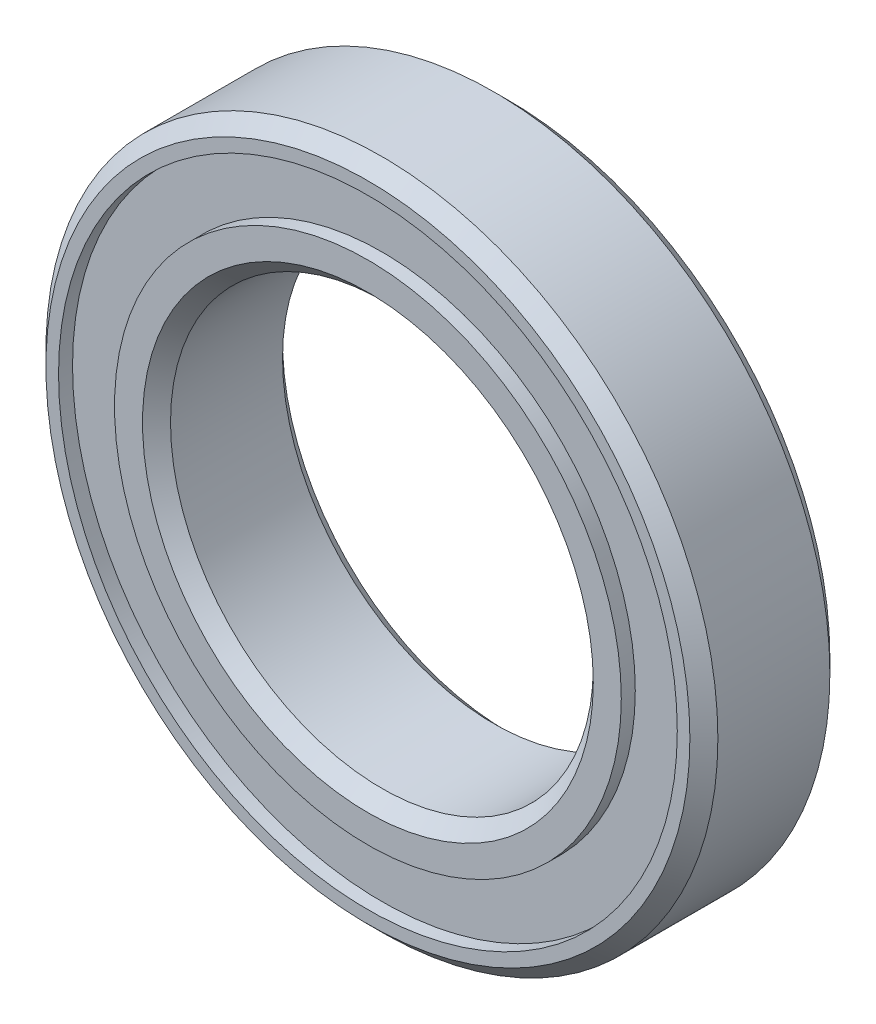
ISO-10303-21;
HEADER;
FILE_DESCRIPTION(('STEP AP214'),'2;1');
FILE_NAME('part.step','',(''),(''),'','','');
FILE_SCHEMA(('AUTOMOTIVE_DESIGN { 1 0 10303 214 1 1 1 1 }'));
ENDSEC;
DATA;
#1=APPLICATION_CONTEXT('core data for automotive mechanical design processes');
#2=APPLICATION_PROTOCOL_DEFINITION('international standard','automotive_design',2000,#1);
#3=PRODUCT_CONTEXT('',#1,'mechanical');
#4=PRODUCT('Part','Part','',(#3));
#5=PRODUCT_RELATED_PRODUCT_CATEGORY('part','',(#4));
#6=PRODUCT_DEFINITION_FORMATION('','',#4);
#7=PRODUCT_DEFINITION_CONTEXT('part definition',#1,'design');
#8=PRODUCT_DEFINITION('design','',#6,#7);
#9=PRODUCT_DEFINITION_SHAPE('','',#8);
#10=(LENGTH_UNIT() NAMED_UNIT(*) SI_UNIT(.MILLI.,.METRE.));
#11=(NAMED_UNIT(*) PLANE_ANGLE_UNIT() SI_UNIT($,.RADIAN.));
#12=(NAMED_UNIT(*) SI_UNIT($,.STERADIAN.) SOLID_ANGLE_UNIT());
#13=UNCERTAINTY_MEASURE_WITH_UNIT(LENGTH_MEASURE(1.E-05),#10,'distance_accuracy_value','');
#14=(GEOMETRIC_REPRESENTATION_CONTEXT(3) GLOBAL_UNCERTAINTY_ASSIGNED_CONTEXT((#13)) GLOBAL_UNIT_ASSIGNED_CONTEXT((#10,
#11,#12)) REPRESENTATION_CONTEXT('',''));
#15=CARTESIAN_POINT('',(0.,0.,0.));
#16=DIRECTION('',(0.,0.,1.));
#17=DIRECTION('',(1.,0.,0.));
#18=AXIS2_PLACEMENT_3D('',#15,#16,#17);
#19=CARTESIAN_POINT('',(0.,0.,0.));
#20=DIRECTION('',(0.,0.,1.));
#21=DIRECTION('',(1.,0.,0.));
#22=AXIS2_PLACEMENT_3D('',#19,#20,#21);
#23=PLANE('',#22);
#24=CARTESIAN_POINT('',(0.,0.,0.));
#25=DIRECTION('',(0.,0.,1.));
#26=DIRECTION('',(1.,0.,0.));
#27=AXIS2_PLACEMENT_3D('',#24,#25,#26);
#28=CIRCLE('',#27,8.05);
#29=CARTESIAN_POINT('',(8.05,0.,0.));
#30=VERTEX_POINT('',#29);
#31=EDGE_CURVE('E54',#30,#30,#28,.T.);
#32=ORIENTED_EDGE('',*,*,#31,.T.);
#33=EDGE_LOOP('',(#32));
#34=FACE_BOUND('',#33,.T.);
#35=CARTESIAN_POINT('',(0.,0.,0.));
#36=DIRECTION('',(0.,0.,-1.));
#37=DIRECTION('',(-1.,0.,0.));
#38=AXIS2_PLACEMENT_3D('',#35,#36,#37);
#39=CIRCLE('',#38,9.05);
#40=CARTESIAN_POINT('',(-9.05,0.,0.));
#41=VERTEX_POINT('',#40);
#42=EDGE_CURVE('E85',#41,#41,#39,.T.);
#43=ORIENTED_EDGE('',*,*,#42,.T.);
#44=EDGE_LOOP('',(#43));
#45=FACE_BOUND('',#44,.T.);
#46=ADVANCED_FACE('F33',(#34,#45),#23,.F.);
#47=CARTESIAN_POINT('',(0.,0.,5.));
#48=DIRECTION('',(0.,0.,1.));
#49=DIRECTION('',(1.,0.,0.));
#50=AXIS2_PLACEMENT_3D('',#47,#48,#49);
#51=PLANE('',#50);
#52=CARTESIAN_POINT('',(0.,0.,5.));
#53=DIRECTION('',(0.,0.,1.));
#54=DIRECTION('',(1.,0.,0.));
#55=AXIS2_PLACEMENT_3D('',#52,#53,#54);
#56=CIRCLE('',#55,8.05);
#57=CARTESIAN_POINT('',(8.05,0.,5.));
#58=VERTEX_POINT('',#57);
#59=EDGE_CURVE('E57',#58,#58,#56,.F.);
#60=ORIENTED_EDGE('',*,*,#59,.T.);
#61=EDGE_LOOP('',(#60));
#62=FACE_BOUND('',#61,.T.);
#63=CARTESIAN_POINT('',(0.,0.,5.));
#64=DIRECTION('',(0.,0.,1.));
#65=DIRECTION('',(1.,0.,0.));
#66=AXIS2_PLACEMENT_3D('',#63,#64,#65);
#67=CIRCLE('',#66,9.05);
#68=CARTESIAN_POINT('',(9.05,0.,5.));
#69=VERTEX_POINT('',#68);
#70=EDGE_CURVE('E73',#69,#69,#67,.T.);
#71=ORIENTED_EDGE('',*,*,#70,.T.);
#72=EDGE_LOOP('',(#71));
#73=FACE_BOUND('',#72,.T.);
#74=ADVANCED_FACE('F118',(#62,#73),#51,.T.);
#75=CARTESIAN_POINT('',(0.,0.,5.));
#76=DIRECTION('',(0.,0.,1.));
#77=DIRECTION('',(1.,0.,0.));
#78=AXIS2_PLACEMENT_3D('',#75,#76,#77);
#79=CIRCLE('',#78,11.5);
#80=CARTESIAN_POINT('',(11.5,0.,5.));
#81=VERTEX_POINT('',#80);
#82=EDGE_CURVE('E49',#81,#81,#79,.T.);
#83=ORIENTED_EDGE('',*,*,#82,.T.);
#84=EDGE_LOOP('',(#83));
#85=FACE_BOUND('',#84,.T.);
#86=CARTESIAN_POINT('',(0.,0.,5.));
#87=DIRECTION('',(0.,0.,1.));
#88=DIRECTION('',(1.,0.,0.));
#89=AXIS2_PLACEMENT_3D('',#86,#87,#88);
#90=CIRCLE('',#89,11.05);
#91=CARTESIAN_POINT('',(11.05,0.,5.));
#92=VERTEX_POINT('',#91);
#93=EDGE_CURVE('E67',#92,#92,#90,.T.);
#94=ORIENTED_EDGE('',*,*,#93,.F.);
#95=EDGE_LOOP('',(#94));
#96=FACE_BOUND('',#95,.T.);
#97=ADVANCED_FACE('F110',(#85,#96),#51,.T.);
#98=CARTESIAN_POINT('',(0.,0.,0.));
#99=DIRECTION('',(0.,0.,1.));
#100=DIRECTION('',(1.,0.,0.));
#101=AXIS2_PLACEMENT_3D('',#98,#99,#100);
#102=CIRCLE('',#101,11.5);
#103=CARTESIAN_POINT('',(11.5,0.,0.));
#104=VERTEX_POINT('',#103);
#105=EDGE_CURVE('E10',#104,#104,#102,.F.);
#106=ORIENTED_EDGE('',*,*,#105,.T.);
#107=EDGE_LOOP('',(#106));
#108=FACE_BOUND('',#107,.T.);
#109=CARTESIAN_POINT('',(0.,0.,0.));
#110=DIRECTION('',(0.,0.,-1.));
#111=DIRECTION('',(-1.,0.,0.));
#112=AXIS2_PLACEMENT_3D('',#109,#110,#111);
#113=CIRCLE('',#112,11.05);
#114=CARTESIAN_POINT('',(-11.05,0.,0.));
#115=VERTEX_POINT('',#114);
#116=EDGE_CURVE('E79',#115,#115,#113,.T.);
#117=ORIENTED_EDGE('',*,*,#116,.F.);
#118=EDGE_LOOP('',(#117));
#119=FACE_BOUND('',#118,.T.);
#120=ADVANCED_FACE('F107',(#108,#119),#23,.F.);
#121=CARTESIAN_POINT('',(0.,0.,5.));
#122=DIRECTION('',(0.,0.,-1.));
#123=DIRECTION('',(-1.,0.,0.));
#124=AXIS2_PLACEMENT_3D('',#121,#122,#123);
#125=CYLINDRICAL_SURFACE('',#124,12.);
#126=CARTESIAN_POINT('',(0.,0.,4.5));
#127=DIRECTION('',(0.,0.,1.));
#128=DIRECTION('',(1.,0.,0.));
#129=AXIS2_PLACEMENT_3D('',#126,#127,#128);
#130=CIRCLE('',#129,12.);
#131=CARTESIAN_POINT('',(12.,0.,4.5));
#132=VERTEX_POINT('',#131);
#133=EDGE_CURVE('E41',#132,#132,#130,.F.);
#134=ORIENTED_EDGE('',*,*,#133,.T.);
#135=EDGE_LOOP('',(#134));
#136=FACE_BOUND('',#135,.T.);
#137=CARTESIAN_POINT('',(0.,0.,0.499999999999999));
#138=DIRECTION('',(0.,0.,1.));
#139=DIRECTION('',(1.,0.,0.));
#140=AXIS2_PLACEMENT_3D('',#137,#138,#139);
#141=CIRCLE('',#140,12.);
#142=CARTESIAN_POINT('',(12.,0.,0.499999999999999));
#143=VERTEX_POINT('',#142);
#144=EDGE_CURVE('E45',#143,#143,#141,.T.);
#145=ORIENTED_EDGE('',*,*,#144,.T.);
#146=EDGE_LOOP('',(#145));
#147=FACE_BOUND('',#146,.T.);
#148=ADVANCED_FACE('F109',(#136,#147),#125,.T.);
#149=CARTESIAN_POINT('',(0.,0.,5.));
#150=DIRECTION('',(0.,0.,-1.));
#151=DIRECTION('',(-1.,0.,0.));
#152=AXIS2_PLACEMENT_3D('',#149,#150,#151);
#153=CYLINDRICAL_SURFACE('',#152,7.55);
#154=CARTESIAN_POINT('',(0.,0.,4.5));
#155=DIRECTION('',(0.,0.,1.));
#156=DIRECTION('',(1.,0.,0.));
#157=AXIS2_PLACEMENT_3D('',#154,#155,#156);
#158=CIRCLE('',#157,7.55);
#159=CARTESIAN_POINT('',(7.55,0.,4.5));
#160=VERTEX_POINT('',#159);
#161=EDGE_CURVE('E60',#160,#160,#158,.T.);
#162=ORIENTED_EDGE('',*,*,#161,.T.);
#163=EDGE_LOOP('',(#162));
#164=FACE_BOUND('',#163,.T.);
#165=CARTESIAN_POINT('',(0.,0.,0.500000000000004));
#166=DIRECTION('',(0.,0.,1.));
#167=DIRECTION('',(1.,0.,0.));
#168=AXIS2_PLACEMENT_3D('',#165,#166,#167);
#169=CIRCLE('',#168,7.55);
#170=CARTESIAN_POINT('',(7.55,0.,0.500000000000004));
#171=VERTEX_POINT('',#170);
#172=EDGE_CURVE('E63',#171,#171,#169,.F.);
#173=ORIENTED_EDGE('',*,*,#172,.T.);
#174=EDGE_LOOP('',(#173));
#175=FACE_BOUND('',#174,.T.);
#176=ADVANCED_FACE('F116',(#164,#175),#153,.F.);
#177=CARTESIAN_POINT('',(0.,0.,4.5));
#178=DIRECTION('',(0.,0.,1.));
#179=DIRECTION('',(1.,0.,0.));
#180=AXIS2_PLACEMENT_3D('',#177,#178,#179);
#181=CYLINDRICAL_SURFACE('',#180,11.05);
#182=CARTESIAN_POINT('',(0.,0.,4.5));
#183=DIRECTION('',(0.,0.,1.));
#184=DIRECTION('',(1.,0.,0.));
#185=AXIS2_PLACEMENT_3D('',#182,#183,#184);
#186=CIRCLE('',#185,11.05);
#187=CARTESIAN_POINT('',(11.05,0.,4.5));
#188=VERTEX_POINT('',#187);
#189=EDGE_CURVE('E66',#188,#188,#186,.T.);
#190=ORIENTED_EDGE('',*,*,#189,.F.);
#191=EDGE_LOOP('',(#190));
#192=FACE_BOUND('',#191,.T.);
#193=ORIENTED_EDGE('',*,*,#93,.T.);
#194=EDGE_LOOP('',(#193));
#195=FACE_BOUND('',#194,.T.);
#196=ADVANCED_FACE('F146',(#192,#195),#181,.F.);
#197=CARTESIAN_POINT('',(0.,0.,4.5));
#198=DIRECTION('',(0.,0.,1.));
#199=DIRECTION('',(1.,0.,0.));
#200=AXIS2_PLACEMENT_3D('',#197,#198,#199);
#201=PLANE('',#200);
#202=CARTESIAN_POINT('',(0.,0.,4.5));
#203=DIRECTION('',(0.,0.,1.));
#204=DIRECTION('',(1.,0.,0.));
#205=AXIS2_PLACEMENT_3D('',#202,#203,#204);
#206=CIRCLE('',#205,9.05);
#207=CARTESIAN_POINT('',(9.05,0.,4.5));
#208=VERTEX_POINT('',#207);
#209=EDGE_CURVE('E70',#208,#208,#206,.T.);
#210=ORIENTED_EDGE('',*,*,#209,.F.);
#211=EDGE_LOOP('',(#210));
#212=FACE_BOUND('',#211,.T.);
#213=ORIENTED_EDGE('',*,*,#189,.T.);
#214=EDGE_LOOP('',(#213));
#215=FACE_BOUND('',#214,.T.);
#216=ADVANCED_FACE('F142',(#212,#215),#201,.T.);
#217=CARTESIAN_POINT('',(0.,0.,4.5));
#218=DIRECTION('',(0.,0.,1.));
#219=DIRECTION('',(1.,0.,0.));
#220=AXIS2_PLACEMENT_3D('',#217,#218,#219);
#221=CYLINDRICAL_SURFACE('',#220,9.05);
#222=ORIENTED_EDGE('',*,*,#209,.T.);
#223=EDGE_LOOP('',(#222));
#224=FACE_BOUND('',#223,.T.);
#225=ORIENTED_EDGE('',*,*,#70,.F.);
#226=EDGE_LOOP('',(#225));
#227=FACE_BOUND('',#226,.T.);
#228=ADVANCED_FACE('F103',(#224,#227),#221,.T.);
#229=CARTESIAN_POINT('',(0.,0.,0.5));
#230=DIRECTION('',(0.,0.,-1.));
#231=DIRECTION('',(-1.,0.,0.));
#232=AXIS2_PLACEMENT_3D('',#229,#230,#231);
#233=CYLINDRICAL_SURFACE('',#232,11.05);
#234=CARTESIAN_POINT('',(0.,0.,0.5));
#235=DIRECTION('',(0.,0.,-1.));
#236=DIRECTION('',(-1.,0.,0.));
#237=AXIS2_PLACEMENT_3D('',#234,#235,#236);
#238=CIRCLE('',#237,11.05);
#239=CARTESIAN_POINT('',(-11.05,0.,0.5));
#240=VERTEX_POINT('',#239);
#241=EDGE_CURVE('E76',#240,#240,#238,.T.);
#242=ORIENTED_EDGE('',*,*,#241,.F.);
#243=EDGE_LOOP('',(#242));
#244=FACE_BOUND('',#243,.T.);
#245=ORIENTED_EDGE('',*,*,#116,.T.);
#246=EDGE_LOOP('',(#245));
#247=FACE_BOUND('',#246,.T.);
#248=ADVANCED_FACE('F97',(#244,#247),#233,.F.);
#249=CARTESIAN_POINT('',(0.,0.,0.5));
#250=DIRECTION('',(0.,0.,-1.));
#251=DIRECTION('',(-1.,0.,0.));
#252=AXIS2_PLACEMENT_3D('',#249,#250,#251);
#253=PLANE('',#252);
#254=CARTESIAN_POINT('',(0.,0.,0.5));
#255=DIRECTION('',(0.,0.,-1.));
#256=DIRECTION('',(-1.,0.,0.));
#257=AXIS2_PLACEMENT_3D('',#254,#255,#256);
#258=CIRCLE('',#257,9.05);
#259=CARTESIAN_POINT('',(-9.05,0.,0.5));
#260=VERTEX_POINT('',#259);
#261=EDGE_CURVE('E82',#260,#260,#258,.T.);
#262=ORIENTED_EDGE('',*,*,#261,.F.);
#263=EDGE_LOOP('',(#262));
#264=FACE_BOUND('',#263,.T.);
#265=ORIENTED_EDGE('',*,*,#241,.T.);
#266=EDGE_LOOP('',(#265));
#267=FACE_BOUND('',#266,.T.);
#268=ADVANCED_FACE('F94',(#264,#267),#253,.T.);
#269=CARTESIAN_POINT('',(0.,0.,0.5));
#270=DIRECTION('',(0.,0.,-1.));
#271=DIRECTION('',(-1.,0.,0.));
#272=AXIS2_PLACEMENT_3D('',#269,#270,#271);
#273=CYLINDRICAL_SURFACE('',#272,9.05);
#274=ORIENTED_EDGE('',*,*,#261,.T.);
#275=EDGE_LOOP('',(#274));
#276=FACE_BOUND('',#275,.T.);
#277=ORIENTED_EDGE('',*,*,#42,.F.);
#278=EDGE_LOOP('',(#277));
#279=FACE_BOUND('',#278,.T.);
#280=ADVANCED_FACE('F91',(#276,#279),#273,.T.);
#281=CARTESIAN_POINT('',(0.,0.,4.5));
#282=DIRECTION('',(0.,0.,1.));
#283=DIRECTION('',(1.,0.,0.));
#284=AXIS2_PLACEMENT_3D('',#281,#282,#283);
#285=CONICAL_SURFACE('',#284,7.55,0.785398163397447);
#286=ORIENTED_EDGE('',*,*,#59,.F.);
#287=EDGE_LOOP('',(#286));
#288=FACE_BOUND('',#287,.T.);
#289=ORIENTED_EDGE('',*,*,#161,.F.);
#290=EDGE_LOOP('',(#289));
#291=FACE_BOUND('',#290,.T.);
#292=ADVANCED_FACE('F131',(#288,#291),#285,.F.);
#293=CARTESIAN_POINT('',(0.,0.,0.));
#294=DIRECTION('',(0.,0.,-1.));
#295=DIRECTION('',(-1.,0.,0.));
#296=AXIS2_PLACEMENT_3D('',#293,#294,#295);
#297=CONICAL_SURFACE('',#296,8.05,0.785398163397443);
#298=ORIENTED_EDGE('',*,*,#172,.F.);
#299=EDGE_LOOP('',(#298));
#300=FACE_BOUND('',#299,.T.);
#301=ORIENTED_EDGE('',*,*,#31,.F.);
#302=EDGE_LOOP('',(#301));
#303=FACE_BOUND('',#302,.T.);
#304=ADVANCED_FACE('F136',(#300,#303),#297,.F.);
#305=CARTESIAN_POINT('',(0.,0.,5.));
#306=DIRECTION('',(0.,0.,-1.));
#307=DIRECTION('',(-1.,0.,0.));
#308=AXIS2_PLACEMENT_3D('',#305,#306,#307);
#309=CONICAL_SURFACE('',#308,11.5,0.785398163397447);
#310=ORIENTED_EDGE('',*,*,#133,.F.);
#311=EDGE_LOOP('',(#310));
#312=FACE_BOUND('',#311,.T.);
#313=ORIENTED_EDGE('',*,*,#82,.F.);
#314=EDGE_LOOP('',(#313));
#315=FACE_BOUND('',#314,.T.);
#316=ADVANCED_FACE('F161',(#312,#315),#309,.T.);
#317=CARTESIAN_POINT('',(0.,0.,0.499999999999999));
#318=DIRECTION('',(0.,0.,1.));
#319=DIRECTION('',(1.,0.,0.));
#320=AXIS2_PLACEMENT_3D('',#317,#318,#319);
#321=CONICAL_SURFACE('',#320,12.,0.78539816339745);
#322=ORIENTED_EDGE('',*,*,#105,.F.);
#323=EDGE_LOOP('',(#322));
#324=FACE_BOUND('',#323,.T.);
#325=ORIENTED_EDGE('',*,*,#144,.F.);
#326=EDGE_LOOP('',(#325));
#327=FACE_BOUND('',#326,.T.);
#328=ADVANCED_FACE('F36',(#324,#327),#321,.T.);
#329=CLOSED_SHELL('',(#46,#74,#97,#120,#148,#176,#196,#216,#228,#248,#268,#280,#292,#304,#316,#328));
#330=MANIFOLD_SOLID_BREP('B2',#329);
#331=ADVANCED_BREP_SHAPE_REPRESENTATION('',(#18,#330),#14);
#332=SHAPE_DEFINITION_REPRESENTATION(#9,#331);
ENDSEC;
END-ISO-10303-21;
